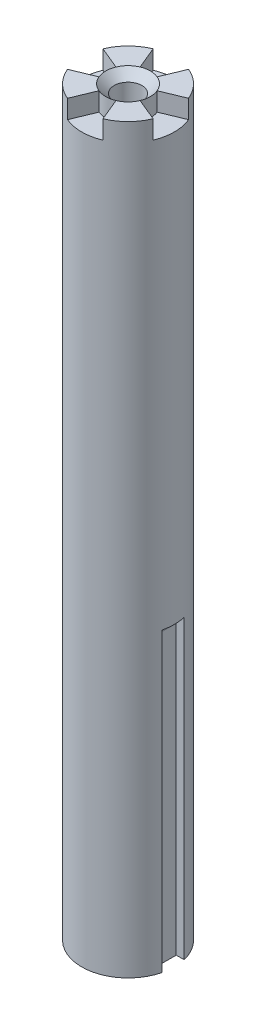
ISO-10303-21;
HEADER;
FILE_DESCRIPTION(('STEP AP214'),'2;1');
FILE_NAME('part.step','',(''),(''),'','','');
FILE_SCHEMA(('AUTOMOTIVE_DESIGN { 1 0 10303 214 1 1 1 1 }'));
ENDSEC;
DATA;
#1=APPLICATION_CONTEXT('core data for automotive mechanical design processes');
#2=APPLICATION_PROTOCOL_DEFINITION('international standard','automotive_design',2000,#1);
#3=PRODUCT_CONTEXT('',#1,'mechanical');
#4=PRODUCT('Part','Part','',(#3));
#5=PRODUCT_RELATED_PRODUCT_CATEGORY('part','',(#4));
#6=PRODUCT_DEFINITION_FORMATION('','',#4);
#7=PRODUCT_DEFINITION_CONTEXT('part definition',#1,'design');
#8=PRODUCT_DEFINITION('design','',#6,#7);
#9=PRODUCT_DEFINITION_SHAPE('','',#8);
#10=(LENGTH_UNIT() NAMED_UNIT(*) SI_UNIT(.MILLI.,.METRE.));
#11=(NAMED_UNIT(*) PLANE_ANGLE_UNIT() SI_UNIT($,.RADIAN.));
#12=(NAMED_UNIT(*) SI_UNIT($,.STERADIAN.) SOLID_ANGLE_UNIT());
#13=UNCERTAINTY_MEASURE_WITH_UNIT(LENGTH_MEASURE(1.E-05),#10,'distance_accuracy_value','');
#14=(GEOMETRIC_REPRESENTATION_CONTEXT(3) GLOBAL_UNCERTAINTY_ASSIGNED_CONTEXT((#13)) GLOBAL_UNIT_ASSIGNED_CONTEXT((#10,
#11,#12)) REPRESENTATION_CONTEXT('',''));
#15=CARTESIAN_POINT('',(0.,0.,0.));
#16=DIRECTION('',(0.,0.,1.));
#17=DIRECTION('',(1.,0.,0.));
#18=AXIS2_PLACEMENT_3D('',#15,#16,#17);
#19=CARTESIAN_POINT('',(0.,101.6,0.));
#20=DIRECTION('',(0.,1.,0.));
#21=DIRECTION('',(0.,0.,1.));
#22=AXIS2_PLACEMENT_3D('',#19,#20,#21);
#23=PLANE('',#22);
#24=DIRECTION('',(-0.382683432365091,0.,0.923879532511287));
#25=VECTOR('',#24,1.);
#26=CARTESIAN_POINT('',(-2.43003979551833,101.6,5.86663503144667));
#27=LINE('',#26,#25);
#28=CARTESIAN_POINT('',(-1.1664191018488,101.6,2.8159848150944));
#29=VERTEX_POINT('',#28);
#30=CARTESIAN_POINT('',(-2.43003979551833,101.6,5.86663503144667));
#31=VERTEX_POINT('',#30);
#32=EDGE_CURVE('E223',#29,#31,#27,.T.);
#33=ORIENTED_EDGE('',*,*,#32,.F.);
#34=CARTESIAN_POINT('',(0.,101.6,0.));
#35=DIRECTION('',(0.,1.,0.));
#36=DIRECTION('',(0.,0.,1.));
#37=AXIS2_PLACEMENT_3D('',#34,#35,#36);
#38=CIRCLE('',#37,3.048);
#39=CARTESIAN_POINT('',(-2.8159848150944,101.6,1.1664191018488));
#40=VERTEX_POINT('',#39);
#41=EDGE_CURVE('E325',#40,#29,#38,.T.);
#42=ORIENTED_EDGE('',*,*,#41,.F.);
#43=DIRECTION('',(0.92387953251129,0.,-0.382683432365084));
#44=VECTOR('',#43,1.);
#45=CARTESIAN_POINT('',(-5.86663503144668,101.6,2.43003979551831));
#46=LINE('',#45,#44);
#47=CARTESIAN_POINT('',(-5.86663503144668,101.6,2.43003979551831));
#48=VERTEX_POINT('',#47);
#49=EDGE_CURVE('E76',#48,#40,#46,.T.);
#50=ORIENTED_EDGE('',*,*,#49,.F.);
#51=CARTESIAN_POINT('',(0.,101.6,0.));
#52=DIRECTION('',(0.,1.,0.));
#53=DIRECTION('',(0.,0.,1.));
#54=AXIS2_PLACEMENT_3D('',#51,#52,#53);
#55=CIRCLE('',#54,6.35);
#56=EDGE_CURVE('E352',#48,#31,#55,.T.);
#57=ORIENTED_EDGE('',*,*,#56,.T.);
#58=EDGE_LOOP('',(#33,#42,#50,#57));
#59=FACE_BOUND('',#58,.T.);
#60=ADVANCED_FACE('F56',(#59),#23,.T.);
#61=DIRECTION('',(-0.923879532511284,0.,-0.382683432365097));
#62=VECTOR('',#61,1.);
#63=CARTESIAN_POINT('',(-5.86663503144666,101.6,-2.43003979551835));
#64=LINE('',#63,#62);
#65=CARTESIAN_POINT('',(-2.8159848150944,101.6,-1.1664191018488));
#66=VERTEX_POINT('',#65);
#67=CARTESIAN_POINT('',(-5.86663503144666,101.6,-2.43003979551835));
#68=VERTEX_POINT('',#67);
#69=EDGE_CURVE('E241',#66,#68,#64,.T.);
#70=ORIENTED_EDGE('',*,*,#69,.F.);
#71=CARTESIAN_POINT('',(-1.1664191018488,101.6,-2.8159848150944));
#72=VERTEX_POINT('',#71);
#73=EDGE_CURVE('E480',#72,#66,#38,.T.);
#74=ORIENTED_EDGE('',*,*,#73,.F.);
#75=DIRECTION('',(0.382683432365078,0.,0.923879532511292));
#76=VECTOR('',#75,1.);
#77=CARTESIAN_POINT('',(-2.43003979551829,101.6,-5.86663503144669));
#78=LINE('',#77,#76);
#79=CARTESIAN_POINT('',(-2.43003979551829,101.6,-5.86663503144669));
#80=VERTEX_POINT('',#79);
#81=EDGE_CURVE('E84',#80,#72,#78,.T.);
#82=ORIENTED_EDGE('',*,*,#81,.F.);
#83=EDGE_CURVE('E506',#80,#68,#55,.T.);
#84=ORIENTED_EDGE('',*,*,#83,.T.);
#85=EDGE_LOOP('',(#70,#74,#82,#84));
#86=FACE_BOUND('',#85,.T.);
#87=ADVANCED_FACE('F461',(#86),#23,.T.);
#88=DIRECTION('',(0.382683432365103,0.,-0.923879532511282));
#89=VECTOR('',#88,1.);
#90=CARTESIAN_POINT('',(2.43003979551837,101.6,-5.86663503144666));
#91=LINE('',#90,#89);
#92=CARTESIAN_POINT('',(1.1664191018488,101.6,-2.8159848150944));
#93=VERTEX_POINT('',#92);
#94=CARTESIAN_POINT('',(2.43003979551837,101.6,-5.86663503144666));
#95=VERTEX_POINT('',#94);
#96=EDGE_CURVE('E270',#93,#95,#91,.T.);
#97=ORIENTED_EDGE('',*,*,#96,.F.);
#98=CARTESIAN_POINT('',(2.8159848150944,101.6,-1.1664191018488));
#99=VERTEX_POINT('',#98);
#100=EDGE_CURVE('E324',#99,#93,#38,.T.);
#101=ORIENTED_EDGE('',*,*,#100,.F.);
#102=DIRECTION('',(-0.923879532511295,0.,0.382683432365072));
#103=VECTOR('',#102,1.);
#104=CARTESIAN_POINT('',(5.8666350314467,101.6,-2.43003979551827));
#105=LINE('',#104,#103);
#106=CARTESIAN_POINT('',(5.8666350314467,101.6,-2.43003979551827));
#107=VERTEX_POINT('',#106);
#108=EDGE_CURVE('E307',#107,#99,#105,.T.);
#109=ORIENTED_EDGE('',*,*,#108,.F.);
#110=EDGE_CURVE('E351',#107,#95,#55,.T.);
#111=ORIENTED_EDGE('',*,*,#110,.T.);
#112=EDGE_LOOP('',(#97,#101,#109,#111));
#113=FACE_BOUND('',#112,.T.);
#114=ADVANCED_FACE('F368',(#113),#23,.T.);
#115=CARTESIAN_POINT('',(0.,101.6,0.));
#116=DIRECTION('',(0.,-1.,0.));
#117=DIRECTION('',(0.,0.,-1.));
#118=AXIS2_PLACEMENT_3D('',#115,#116,#117);
#119=CYLINDRICAL_SURFACE('',#118,6.35);
#120=CARTESIAN_POINT('',(0.,99.06,0.));
#121=DIRECTION('',(0.,1.,0.));
#122=DIRECTION('',(0.,0.,1.));
#123=AXIS2_PLACEMENT_3D('',#120,#121,#122);
#124=CIRCLE('',#123,6.35);
#125=CARTESIAN_POINT('',(-2.43003979551833,99.06,5.86663503144667));
#126=VERTEX_POINT('',#125);
#127=CARTESIAN_POINT('',(2.43003979551833,99.06,5.86663503144667));
#128=VERTEX_POINT('',#127);
#129=EDGE_CURVE('E214',#126,#128,#124,.T.);
#130=ORIENTED_EDGE('',*,*,#129,.F.);
#131=DIRECTION('',(0.,1.,0.));
#132=VECTOR('',#131,1.);
#133=CARTESIAN_POINT('',(-2.43003979551833,99.06,5.86663503144667));
#134=LINE('',#133,#132);
#135=EDGE_CURVE('E481',#126,#31,#134,.T.);
#136=ORIENTED_EDGE('',*,*,#135,.T.);
#137=ORIENTED_EDGE('',*,*,#56,.F.);
#138=DIRECTION('',(0.,1.,0.));
#139=VECTOR('',#138,1.);
#140=CARTESIAN_POINT('',(-5.86663503144668,99.06,2.43003979551831));
#141=LINE('',#140,#139);
#142=CARTESIAN_POINT('',(-5.86663503144668,99.06,2.43003979551831));
#143=VERTEX_POINT('',#142);
#144=EDGE_CURVE('E250',#143,#48,#141,.T.);
#145=ORIENTED_EDGE('',*,*,#144,.F.);
#146=CARTESIAN_POINT('',(0.,99.06,0.));
#147=DIRECTION('',(0.,1.,0.));
#148=DIRECTION('',(0.,0.,1.));
#149=AXIS2_PLACEMENT_3D('',#146,#147,#148);
#150=CIRCLE('',#149,6.35);
#151=CARTESIAN_POINT('',(-5.86663503144667,99.06,-2.43003979551835));
#152=VERTEX_POINT('',#151);
#153=EDGE_CURVE('E237',#152,#143,#150,.T.);
#154=ORIENTED_EDGE('',*,*,#153,.F.);
#155=DIRECTION('',(0.,1.,0.));
#156=VECTOR('',#155,1.);
#157=CARTESIAN_POINT('',(-5.86663503144667,99.06,-2.43003979551835));
#158=LINE('',#157,#156);
#159=EDGE_CURVE('E257',#152,#68,#158,.T.);
#160=ORIENTED_EDGE('',*,*,#159,.T.);
#161=ORIENTED_EDGE('',*,*,#83,.F.);
#162=DIRECTION('',(0.,1.,0.));
#163=VECTOR('',#162,1.);
#164=CARTESIAN_POINT('',(-2.43003979551829,99.06,-5.86663503144669));
#165=LINE('',#164,#163);
#166=CARTESIAN_POINT('',(-2.43003979551829,99.06,-5.86663503144669));
#167=VERTEX_POINT('',#166);
#168=EDGE_CURVE('E279',#167,#80,#165,.T.);
#169=ORIENTED_EDGE('',*,*,#168,.F.);
#170=CARTESIAN_POINT('',(0.,99.06,0.));
#171=DIRECTION('',(0.,1.,0.));
#172=DIRECTION('',(0.,0.,1.));
#173=AXIS2_PLACEMENT_3D('',#170,#171,#172);
#174=CIRCLE('',#173,6.35);
#175=CARTESIAN_POINT('',(2.43003979551837,99.06,-5.86663503144666));
#176=VERTEX_POINT('',#175);
#177=EDGE_CURVE('E266',#176,#167,#174,.T.);
#178=ORIENTED_EDGE('',*,*,#177,.F.);
#179=DIRECTION('',(0.,1.,0.));
#180=VECTOR('',#179,1.);
#181=CARTESIAN_POINT('',(2.43003979551837,99.06,-5.86663503144666));
#182=LINE('',#181,#180);
#183=EDGE_CURVE('E253',#176,#95,#182,.T.);
#184=ORIENTED_EDGE('',*,*,#183,.T.);
#185=ORIENTED_EDGE('',*,*,#110,.F.);
#186=DIRECTION('',(0.,1.,0.));
#187=VECTOR('',#186,1.);
#188=CARTESIAN_POINT('',(5.8666350314467,99.06,-2.43003979551827));
#189=LINE('',#188,#187);
#190=CARTESIAN_POINT('',(5.8666350314467,99.06,-2.43003979551827));
#191=VERTEX_POINT('',#190);
#192=EDGE_CURVE('E306',#191,#107,#189,.T.);
#193=ORIENTED_EDGE('',*,*,#192,.F.);
#194=CARTESIAN_POINT('',(0.,99.06,0.));
#195=DIRECTION('',(0.,1.,0.));
#196=DIRECTION('',(0.,0.,1.));
#197=AXIS2_PLACEMENT_3D('',#194,#195,#196);
#198=CIRCLE('',#197,6.35);
#199=CARTESIAN_POINT('',(5.86663503144665,99.06,2.43003979551839));
#200=VERTEX_POINT('',#199);
#201=EDGE_CURVE('E293',#200,#191,#198,.T.);
#202=ORIENTED_EDGE('',*,*,#201,.F.);
#203=DIRECTION('',(0.,1.,0.));
#204=VECTOR('',#203,1.);
#205=CARTESIAN_POINT('',(5.86663503144665,99.06,2.43003979551839));
#206=LINE('',#205,#204);
#207=CARTESIAN_POINT('',(5.86663503144665,101.6,2.43003979551839));
#208=VERTEX_POINT('',#207);
#209=EDGE_CURVE('E282',#200,#208,#206,.T.);
#210=ORIENTED_EDGE('',*,*,#209,.T.);
#211=CARTESIAN_POINT('',(2.43003979551833,101.6,5.86663503144667));
#212=VERTEX_POINT('',#211);
#213=EDGE_CURVE('E230',#212,#208,#55,.T.);
#214=ORIENTED_EDGE('',*,*,#213,.F.);
#215=DIRECTION('',(0.,1.,0.));
#216=VECTOR('',#215,1.);
#217=CARTESIAN_POINT('',(2.43003979551833,99.06,5.86663503144667));
#218=LINE('',#217,#216);
#219=EDGE_CURVE('E206',#128,#212,#218,.T.);
#220=ORIENTED_EDGE('',*,*,#219,.F.);
#221=EDGE_LOOP('',(#130,#136,#137,#145,#154,#160,#161,#169,#178,#184,#185,#193,#202,#210,#214,#220));
#222=FACE_BOUND('',#221,.T.);
#223=DIRECTION('',(0.,-1.,0.));
#224=VECTOR('',#223,1.);
#225=CARTESIAN_POINT('',(6.1644078385519,40.64,1.524));
#226=LINE('',#225,#224);
#227=CARTESIAN_POINT('',(6.1644078385519,40.6263660094133,1.524));
#228=VERTEX_POINT('',#227);
#229=CARTESIAN_POINT('',(6.1644078385519,0.,1.524));
#230=VERTEX_POINT('',#229);
#231=EDGE_CURVE('E340',#228,#230,#226,.T.);
#232=ORIENTED_EDGE('',*,*,#231,.F.);
#233=CARTESIAN_POINT('',(6.1644078385519,40.6263660094133,1.524));
#234=CARTESIAN_POINT('',(6.1798203609569,40.6286386184408,1.4616590567087));
#235=CARTESIAN_POINT('',(6.19428886265832,40.6304907967999,1.39907540649519));
#236=CARTESIAN_POINT('',(6.22132300982925,40.6335384012742,1.27348550614949));
#237=CARTESIAN_POINT('',(6.2338887495537,40.6347338599283,1.21047927711168));
#238=CARTESIAN_POINT('',(6.26862280986946,40.6376042038102,1.02139583434353));
#239=CARTESIAN_POINT('',(6.28794622912084,40.6385776341967,0.89477525458629));
#240=CARTESIAN_POINT('',(6.3189022356201,40.6397136799146,0.640598246259459));
#241=CARTESIAN_POINT('',(6.33053492832501,40.639876306364,0.513041830546522));
#242=CARTESIAN_POINT('',(6.34220031806305,40.6399811653716,0.32113074344049));
#243=CARTESIAN_POINT('',(6.34512485961095,40.6399928265535,0.256940998112656));
#244=CARTESIAN_POINT('',(6.3490247241951,40.640000435766,0.128502050799768));
#245=CARTESIAN_POINT('',(6.35000003908424,40.639996383731,0.0642528485673284));
#246=CARTESIAN_POINT('',(6.35,40.64,0.));
#247=B_SPLINE_CURVE_WITH_KNOTS('',3,(#233,#234,#235,#236,#237,#238,#239,#240,#241,#242,#243,
#244,#245,#246),.UNSPECIFIED.,.F.,.F.,(4,2,2,2,2,2,4),(0.,0.192755135212261,0.385500719007915,
0.769514909266387,1.15352383372331,1.3462668856024,1.5390107430807),.UNSPECIFIED.);
#248=CARTESIAN_POINT('',(6.35,40.64,0.));
#249=VERTEX_POINT('',#248);
#250=EDGE_CURVE('E13',#228,#249,#247,.T.);
#251=ORIENTED_EDGE('',*,*,#250,.T.);
#252=CARTESIAN_POINT('',(6.35,40.64,0.));
#253=CARTESIAN_POINT('',(6.35000003908424,40.639996383731,-0.0642528485673275));
#254=CARTESIAN_POINT('',(6.3490247241951,40.640000435766,-0.128502050799768));
#255=CARTESIAN_POINT('',(6.34512485961095,40.6399928265535,-0.256940998112655));
#256=CARTESIAN_POINT('',(6.34220031806305,40.6399811653716,-0.32113074344049));
#257=CARTESIAN_POINT('',(6.33053492832501,40.639876306364,-0.513041830546522));
#258=CARTESIAN_POINT('',(6.3189022356201,40.6397136799146,-0.640598246259459));
#259=CARTESIAN_POINT('',(6.28794622912084,40.6385776341967,-0.89477525458629));
#260=CARTESIAN_POINT('',(6.26862280986946,40.6376042038102,-1.02139583434353));
#261=CARTESIAN_POINT('',(6.2338887495537,40.6347338599283,-1.21047927711168));
#262=CARTESIAN_POINT('',(6.22132300982925,40.6335384012742,-1.27348550614949));
#263=CARTESIAN_POINT('',(6.19428886265832,40.6304907967999,-1.39907540649519));
#264=CARTESIAN_POINT('',(6.1798203609569,40.6286386184408,-1.4616590567087));
#265=CARTESIAN_POINT('',(6.1644078385519,40.6263660094133,-1.524));
#266=B_SPLINE_CURVE_WITH_KNOTS('',3,(#252,#253,#254,#255,#256,#257,#258,#259,#260,#261,#262,
#263,#264,#265),.UNSPECIFIED.,.F.,.F.,(4,2,2,2,2,2,4),(0.,0.1927438574783,0.38548690935739,
0.769495833814311,1.15351002407278,1.34625560786844,1.5390107430807),.UNSPECIFIED.);
#267=CARTESIAN_POINT('',(6.1644078385519,40.6263660094133,-1.524));
#268=VERTEX_POINT('',#267);
#269=EDGE_CURVE('E69',#249,#268,#266,.T.);
#270=ORIENTED_EDGE('',*,*,#269,.T.);
#271=DIRECTION('',(0.,-1.,0.));
#272=VECTOR('',#271,1.);
#273=CARTESIAN_POINT('',(6.1644078385519,40.64,-1.524));
#274=LINE('',#273,#272);
#275=CARTESIAN_POINT('',(6.1644078385519,0.,-1.524));
#276=VERTEX_POINT('',#275);
#277=EDGE_CURVE('E341',#268,#276,#274,.T.);
#278=ORIENTED_EDGE('',*,*,#277,.T.);
#279=CARTESIAN_POINT('',(0.,0.,0.));
#280=DIRECTION('',(0.,1.,0.));
#281=DIRECTION('',(0.,0.,1.));
#282=AXIS2_PLACEMENT_3D('',#279,#280,#281);
#283=CIRCLE('',#282,6.35);
#284=EDGE_CURVE('E343',#276,#230,#283,.T.);
#285=ORIENTED_EDGE('',*,*,#284,.T.);
#286=EDGE_LOOP('',(#232,#251,#270,#278,#285));
#287=FACE_BOUND('',#286,.T.);
#288=ADVANCED_FACE('F226',(#222,#287),#119,.T.);
#289=DIRECTION('',(-0.382683432365091,0.,-0.923879532511287));
#290=VECTOR('',#289,1.);
#291=CARTESIAN_POINT('',(2.43003979551833,101.6,5.86663503144667));
#292=LINE('',#291,#290);
#293=CARTESIAN_POINT('',(1.1664191018488,101.6,2.8159848150944));
#294=VERTEX_POINT('',#293);
#295=EDGE_CURVE('E260',#212,#294,#292,.T.);
#296=ORIENTED_EDGE('',*,*,#295,.F.);
#297=ORIENTED_EDGE('',*,*,#213,.T.);
#298=DIRECTION('',(0.923879532511279,0.,0.382683432365109));
#299=VECTOR('',#298,1.);
#300=CARTESIAN_POINT('',(5.86663503144665,101.6,2.43003979551839));
#301=LINE('',#300,#299);
#302=CARTESIAN_POINT('',(2.8159848150944,101.6,1.1664191018488));
#303=VERTEX_POINT('',#302);
#304=EDGE_CURVE('E297',#303,#208,#301,.T.);
#305=ORIENTED_EDGE('',*,*,#304,.F.);
#306=EDGE_CURVE('E320',#294,#303,#38,.T.);
#307=ORIENTED_EDGE('',*,*,#306,.F.);
#308=EDGE_LOOP('',(#296,#297,#305,#307));
#309=FACE_BOUND('',#308,.T.);
#310=ADVANCED_FACE('F367',(#309),#23,.T.);
#311=CARTESIAN_POINT('',(0.,0.,0.));
#312=DIRECTION('',(0.,1.,0.));
#313=DIRECTION('',(0.,0.,1.));
#314=AXIS2_PLACEMENT_3D('',#311,#312,#313);
#315=PLANE('',#314);
#316=ORIENTED_EDGE('',*,*,#284,.F.);
#317=DIRECTION('',(1.,0.,0.));
#318=VECTOR('',#317,1.);
#319=CARTESIAN_POINT('',(5.08,0.,-1.524));
#320=LINE('',#319,#318);
#321=CARTESIAN_POINT('',(5.08,0.,-1.524));
#322=VERTEX_POINT('',#321);
#323=EDGE_CURVE('E337',#322,#276,#320,.T.);
#324=ORIENTED_EDGE('',*,*,#323,.F.);
#325=DIRECTION('',(0.,0.,-1.));
#326=VECTOR('',#325,1.);
#327=CARTESIAN_POINT('',(5.08,0.,1.524));
#328=LINE('',#327,#326);
#329=CARTESIAN_POINT('',(5.08,0.,1.524));
#330=VERTEX_POINT('',#329);
#331=EDGE_CURVE('E334',#330,#322,#328,.T.);
#332=ORIENTED_EDGE('',*,*,#331,.F.);
#333=DIRECTION('',(-1.,0.,0.));
#334=VECTOR('',#333,1.);
#335=CARTESIAN_POINT('',(6.1644078385519,0.,1.524));
#336=LINE('',#335,#334);
#337=EDGE_CURVE('E331',#230,#330,#336,.T.);
#338=ORIENTED_EDGE('',*,*,#337,.F.);
#339=EDGE_LOOP('',(#316,#324,#332,#338));
#340=FACE_BOUND('',#339,.T.);
#341=ADVANCED_FACE('F369',(#340),#315,.F.);
#342=CARTESIAN_POINT('',(5.08,40.64,-1.524));
#343=DIRECTION('',(0.,0.,-1.));
#344=DIRECTION('',(-1.,0.,0.));
#345=AXIS2_PLACEMENT_3D('',#342,#343,#344);
#346=PLANE('',#345);
#347=ORIENTED_EDGE('',*,*,#277,.F.);
#348=CARTESIAN_POINT('',(6.35,39.37,-1.524));
#349=DIRECTION('',(0.,0.,-1.));
#350=DIRECTION('',(-1.,0.,0.));
#351=AXIS2_PLACEMENT_3D('',#348,#349,#350);
#352=CIRCLE('',#351,1.27);
#353=CARTESIAN_POINT('',(5.08,39.37,-1.524));
#354=VERTEX_POINT('',#353);
#355=EDGE_CURVE('E350',#268,#354,#352,.F.);
#356=ORIENTED_EDGE('',*,*,#355,.T.);
#357=DIRECTION('',(0.,-1.,0.));
#358=VECTOR('',#357,1.);
#359=CARTESIAN_POINT('',(5.08,40.64,-1.524));
#360=LINE('',#359,#358);
#361=EDGE_CURVE('E344',#354,#322,#360,.T.);
#362=ORIENTED_EDGE('',*,*,#361,.T.);
#363=ORIENTED_EDGE('',*,*,#323,.T.);
#364=EDGE_LOOP('',(#347,#356,#362,#363));
#365=FACE_BOUND('',#364,.T.);
#366=ADVANCED_FACE('F373',(#365),#346,.F.);
#367=CARTESIAN_POINT('',(5.08,40.64,1.524));
#368=DIRECTION('',(-1.,0.,0.));
#369=DIRECTION('',(0.,0.,1.));
#370=AXIS2_PLACEMENT_3D('',#367,#368,#369);
#371=PLANE('',#370);
#372=ORIENTED_EDGE('',*,*,#361,.F.);
#373=DIRECTION('',(0.,0.,-1.));
#374=VECTOR('',#373,1.);
#375=CARTESIAN_POINT('',(5.08,39.37,1.524));
#376=LINE('',#375,#374);
#377=CARTESIAN_POINT('',(5.08,39.37,1.524));
#378=VERTEX_POINT('',#377);
#379=EDGE_CURVE('E356',#354,#378,#376,.F.);
#380=ORIENTED_EDGE('',*,*,#379,.T.);
#381=DIRECTION('',(0.,-1.,0.));
#382=VECTOR('',#381,1.);
#383=CARTESIAN_POINT('',(5.08,40.64,1.524));
#384=LINE('',#383,#382);
#385=EDGE_CURVE('E346',#378,#330,#384,.T.);
#386=ORIENTED_EDGE('',*,*,#385,.T.);
#387=ORIENTED_EDGE('',*,*,#331,.T.);
#388=EDGE_LOOP('',(#372,#380,#386,#387));
#389=FACE_BOUND('',#388,.T.);
#390=ADVANCED_FACE('F381',(#389),#371,.F.);
#391=CARTESIAN_POINT('',(6.1644078385519,40.64,1.524));
#392=DIRECTION('',(0.,0.,1.));
#393=DIRECTION('',(1.,0.,0.));
#394=AXIS2_PLACEMENT_3D('',#391,#392,#393);
#395=PLANE('',#394);
#396=ORIENTED_EDGE('',*,*,#385,.F.);
#397=CARTESIAN_POINT('',(6.35,39.37,1.524));
#398=DIRECTION('',(0.,0.,1.));
#399=DIRECTION('',(1.,0.,0.));
#400=AXIS2_PLACEMENT_3D('',#397,#398,#399);
#401=CIRCLE('',#400,1.27);
#402=EDGE_CURVE('E359',#378,#228,#401,.F.);
#403=ORIENTED_EDGE('',*,*,#402,.T.);
#404=ORIENTED_EDGE('',*,*,#231,.T.);
#405=ORIENTED_EDGE('',*,*,#337,.T.);
#406=EDGE_LOOP('',(#396,#403,#404,#405));
#407=FACE_BOUND('',#406,.T.);
#408=ADVANCED_FACE('F378',(#407),#395,.F.);
#409=CARTESIAN_POINT('',(6.35,39.37,0.));
#410=DIRECTION('',(0.,0.,-1.));
#411=DIRECTION('',(-1.,0.,0.));
#412=AXIS2_PLACEMENT_3D('',#409,#410,#411);
#413=CYLINDRICAL_SURFACE('',#412,1.27);
#414=ORIENTED_EDGE('',*,*,#402,.F.);
#415=ORIENTED_EDGE('',*,*,#379,.F.);
#416=ORIENTED_EDGE('',*,*,#355,.F.);
#417=ORIENTED_EDGE('',*,*,#269,.F.);
#418=ORIENTED_EDGE('',*,*,#250,.F.);
#419=EDGE_LOOP('',(#414,#415,#416,#417,#418));
#420=FACE_BOUND('',#419,.T.);
#421=ADVANCED_FACE('F58',(#420),#413,.F.);
#422=CARTESIAN_POINT('',(0.,88.646,0.));
#423=DIRECTION('',(0.,1.,0.));
#424=DIRECTION('',(0.,0.,1.));
#425=AXIS2_PLACEMENT_3D('',#422,#423,#424);
#426=CONICAL_SURFACE('',#425,1.89865,1.02974425867665);
#427=CARTESIAN_POINT('',(0.,87.5051759856833,0.));
#428=VERTEX_POINT('',#427);
#429=VERTEX_LOOP('',#428);
#430=FACE_BOUND('',#429,.T.);
#431=CARTESIAN_POINT('',(0.,88.646,0.));
#432=DIRECTION('',(0.,1.,0.));
#433=DIRECTION('',(0.,0.,1.));
#434=AXIS2_PLACEMENT_3D('',#431,#432,#433);
#435=CIRCLE('',#434,1.89865);
#436=CARTESIAN_POINT('',(0.,88.646,1.89865));
#437=VERTEX_POINT('',#436);
#438=EDGE_CURVE('E328',#437,#437,#435,.T.);
#439=ORIENTED_EDGE('',*,*,#438,.T.);
#440=EDGE_LOOP('',(#439));
#441=FACE_BOUND('',#440,.T.);
#442=ADVANCED_FACE('F389',(#430,#441),#426,.F.);
#443=CARTESIAN_POINT('',(0.,101.6,0.));
#444=DIRECTION('',(0.,1.,0.));
#445=DIRECTION('',(0.,0.,1.));
#446=AXIS2_PLACEMENT_3D('',#443,#444,#445);
#447=CYLINDRICAL_SURFACE('',#446,1.89865);
#448=ORIENTED_EDGE('',*,*,#438,.F.);
#449=EDGE_LOOP('',(#448));
#450=FACE_BOUND('',#449,.T.);
#451=CARTESIAN_POINT('',(0.,100.45065,0.));
#452=DIRECTION('',(0.,1.,0.));
#453=DIRECTION('',(0.,0.,1.));
#454=AXIS2_PLACEMENT_3D('',#451,#452,#453);
#455=CIRCLE('',#454,1.89865);
#456=CARTESIAN_POINT('',(0.,100.45065,1.89865));
#457=VERTEX_POINT('',#456);
#458=EDGE_CURVE('E323',#457,#457,#455,.T.);
#459=ORIENTED_EDGE('',*,*,#458,.T.);
#460=EDGE_LOOP('',(#459));
#461=FACE_BOUND('',#460,.T.);
#462=ADVANCED_FACE('F392',(#450,#461),#447,.F.);
#463=CARTESIAN_POINT('',(0.,101.6,0.));
#464=DIRECTION('',(0.,1.,0.));
#465=DIRECTION('',(0.,0.,1.));
#466=AXIS2_PLACEMENT_3D('',#463,#464,#465);
#467=CONICAL_SURFACE('',#466,3.048,0.785398163397446);
#468=ORIENTED_EDGE('',*,*,#458,.F.);
#469=EDGE_LOOP('',(#468));
#470=FACE_BOUND('',#469,.T.);
#471=ORIENTED_EDGE('',*,*,#306,.T.);
#472=CARTESIAN_POINT('',(0.,101.6,0.));
#473=DIRECTION('',(0.,-1.,0.));
#474=DIRECTION('',(0.,0.,1.));
#475=AXIS2_PLACEMENT_3D('',#472,#473,#474);
#476=CIRCLE('',#475,3.048);
#477=EDGE_CURVE('E309',#99,#303,#476,.T.);
#478=ORIENTED_EDGE('',*,*,#477,.F.);
#479=ORIENTED_EDGE('',*,*,#100,.T.);
#480=CARTESIAN_POINT('',(0.,101.6,0.));
#481=DIRECTION('',(0.,-1.,0.));
#482=DIRECTION('',(0.,0.,1.));
#483=AXIS2_PLACEMENT_3D('',#480,#481,#482);
#484=CIRCLE('',#483,3.048);
#485=EDGE_CURVE('E281',#72,#93,#484,.T.);
#486=ORIENTED_EDGE('',*,*,#485,.F.);
#487=ORIENTED_EDGE('',*,*,#73,.T.);
#488=CARTESIAN_POINT('',(0.,101.6,0.));
#489=DIRECTION('',(0.,-1.,0.));
#490=DIRECTION('',(0.,0.,1.));
#491=AXIS2_PLACEMENT_3D('',#488,#489,#490);
#492=CIRCLE('',#491,3.048);
#493=EDGE_CURVE('E252',#40,#66,#492,.T.);
#494=ORIENTED_EDGE('',*,*,#493,.F.);
#495=ORIENTED_EDGE('',*,*,#41,.T.);
#496=CARTESIAN_POINT('',(0.,101.6,0.));
#497=DIRECTION('',(0.,-1.,0.));
#498=DIRECTION('',(0.,0.,1.));
#499=AXIS2_PLACEMENT_3D('',#496,#497,#498);
#500=CIRCLE('',#499,3.048);
#501=EDGE_CURVE('E473',#294,#29,#500,.T.);
#502=ORIENTED_EDGE('',*,*,#501,.F.);
#503=EDGE_LOOP('',(#471,#478,#479,#486,#487,#494,#495,#502));
#504=FACE_BOUND('',#503,.T.);
#505=ADVANCED_FACE('F396',(#470,#504),#467,.F.);
#506=CARTESIAN_POINT('',(5.86663503144665,99.06,2.43003979551839));
#507=DIRECTION('',(-0.382683432365109,0.,0.923879532511279));
#508=DIRECTION('',(0.923879532511279,0.,0.382683432365109));
#509=AXIS2_PLACEMENT_3D('',#506,#507,#508);
#510=PLANE('',#509);
#511=ORIENTED_EDGE('',*,*,#304,.T.);
#512=ORIENTED_EDGE('',*,*,#209,.F.);
#513=DIRECTION('',(0.923879532511279,0.,0.382683432365109));
#514=VECTOR('',#513,1.);
#515=CARTESIAN_POINT('',(5.86663503144665,99.06,2.43003979551839));
#516=LINE('',#515,#514);
#517=CARTESIAN_POINT('',(2.8159848150944,99.06,1.1664191018488));
#518=VERTEX_POINT('',#517);
#519=EDGE_CURVE('E303',#518,#200,#516,.T.);
#520=ORIENTED_EDGE('',*,*,#519,.F.);
#521=DIRECTION('',(0.,1.,0.));
#522=VECTOR('',#521,1.);
#523=CARTESIAN_POINT('',(2.8159848150944,99.06,1.1664191018488));
#524=LINE('',#523,#522);
#525=EDGE_CURVE('E314',#518,#303,#524,.T.);
#526=ORIENTED_EDGE('',*,*,#525,.T.);
#527=EDGE_LOOP('',(#511,#512,#520,#526));
#528=FACE_BOUND('',#527,.T.);
#529=ADVANCED_FACE('F400',(#528),#510,.F.);
#530=CARTESIAN_POINT('',(0.,99.06,0.));
#531=DIRECTION('',(0.,1.,0.));
#532=DIRECTION('',(0.,0.,1.));
#533=AXIS2_PLACEMENT_3D('',#530,#531,#532);
#534=CYLINDRICAL_SURFACE('',#533,3.048);
#535=ORIENTED_EDGE('',*,*,#477,.T.);
#536=ORIENTED_EDGE('',*,*,#525,.F.);
#537=CARTESIAN_POINT('',(0.,99.06,0.));
#538=DIRECTION('',(0.,-1.,0.));
#539=DIRECTION('',(0.,0.,1.));
#540=AXIS2_PLACEMENT_3D('',#537,#538,#539);
#541=CIRCLE('',#540,3.048);
#542=CARTESIAN_POINT('',(2.8159848150944,99.06,-1.1664191018488));
#543=VERTEX_POINT('',#542);
#544=EDGE_CURVE('E300',#543,#518,#541,.T.);
#545=ORIENTED_EDGE('',*,*,#544,.F.);
#546=DIRECTION('',(0.,1.,0.));
#547=VECTOR('',#546,1.);
#548=CARTESIAN_POINT('',(2.8159848150944,99.06,-1.1664191018488));
#549=LINE('',#548,#547);
#550=EDGE_CURVE('E316',#543,#99,#549,.T.);
#551=ORIENTED_EDGE('',*,*,#550,.T.);
#552=EDGE_LOOP('',(#535,#536,#545,#551));
#553=FACE_BOUND('',#552,.T.);
#554=ADVANCED_FACE('F406',(#553),#534,.T.);
#555=CARTESIAN_POINT('',(5.8666350314467,99.06,-2.43003979551827));
#556=DIRECTION('',(-0.382683432365072,0.,-0.923879532511295));
#557=DIRECTION('',(-0.923879532511295,0.,0.382683432365072));
#558=AXIS2_PLACEMENT_3D('',#555,#556,#557);
#559=PLANE('',#558);
#560=ORIENTED_EDGE('',*,*,#108,.T.);
#561=ORIENTED_EDGE('',*,*,#550,.F.);
#562=DIRECTION('',(-0.923879532511295,0.,0.382683432365072));
#563=VECTOR('',#562,1.);
#564=CARTESIAN_POINT('',(5.8666350314467,99.06,-2.43003979551827));
#565=LINE('',#564,#563);
#566=EDGE_CURVE('E296',#191,#543,#565,.T.);
#567=ORIENTED_EDGE('',*,*,#566,.F.);
#568=ORIENTED_EDGE('',*,*,#192,.T.);
#569=EDGE_LOOP('',(#560,#561,#567,#568));
#570=FACE_BOUND('',#569,.T.);
#571=ADVANCED_FACE('F402',(#570),#559,.F.);
#572=CARTESIAN_POINT('',(0.,99.06,0.));
#573=DIRECTION('',(0.,1.,0.));
#574=DIRECTION('',(0.,0.,1.));
#575=AXIS2_PLACEMENT_3D('',#572,#573,#574);
#576=PLANE('',#575);
#577=ORIENTED_EDGE('',*,*,#201,.T.);
#578=ORIENTED_EDGE('',*,*,#566,.T.);
#579=ORIENTED_EDGE('',*,*,#544,.T.);
#580=ORIENTED_EDGE('',*,*,#519,.T.);
#581=EDGE_LOOP('',(#577,#578,#579,#580));
#582=FACE_BOUND('',#581,.T.);
#583=ADVANCED_FACE('F405',(#582),#576,.T.);
#584=CARTESIAN_POINT('',(2.43003979551837,99.06,-5.86663503144666));
#585=DIRECTION('',(0.923879532511282,0.,0.382683432365103));
#586=DIRECTION('',(0.382683432365103,0.,-0.923879532511282));
#587=AXIS2_PLACEMENT_3D('',#584,#585,#586);
#588=PLANE('',#587);
#589=ORIENTED_EDGE('',*,*,#96,.T.);
#590=ORIENTED_EDGE('',*,*,#183,.F.);
#591=DIRECTION('',(0.382683432365103,0.,-0.923879532511282));
#592=VECTOR('',#591,1.);
#593=CARTESIAN_POINT('',(2.43003979551837,99.06,-5.86663503144666));
#594=LINE('',#593,#592);
#595=CARTESIAN_POINT('',(1.1664191018488,99.06,-2.8159848150944));
#596=VERTEX_POINT('',#595);
#597=EDGE_CURVE('E276',#596,#176,#594,.T.);
#598=ORIENTED_EDGE('',*,*,#597,.F.);
#599=DIRECTION('',(0.,1.,0.));
#600=VECTOR('',#599,1.);
#601=CARTESIAN_POINT('',(1.1664191018488,99.06,-2.8159848150944));
#602=LINE('',#601,#600);
#603=EDGE_CURVE('E288',#596,#93,#602,.T.);
#604=ORIENTED_EDGE('',*,*,#603,.T.);
#605=EDGE_LOOP('',(#589,#590,#598,#604));
#606=FACE_BOUND('',#605,.T.);
#607=ADVANCED_FACE('F416',(#606),#588,.F.);
#608=CARTESIAN_POINT('',(0.,99.06,0.));
#609=DIRECTION('',(0.,1.,0.));
#610=DIRECTION('',(0.,0.,1.));
#611=AXIS2_PLACEMENT_3D('',#608,#609,#610);
#612=CYLINDRICAL_SURFACE('',#611,3.048);
#613=ORIENTED_EDGE('',*,*,#485,.T.);
#614=ORIENTED_EDGE('',*,*,#603,.F.);
#615=CARTESIAN_POINT('',(0.,99.06,0.));
#616=DIRECTION('',(0.,-1.,0.));
#617=DIRECTION('',(0.,0.,1.));
#618=AXIS2_PLACEMENT_3D('',#615,#616,#617);
#619=CIRCLE('',#618,3.048);
#620=CARTESIAN_POINT('',(-1.1664191018488,99.06,-2.8159848150944));
#621=VERTEX_POINT('',#620);
#622=EDGE_CURVE('E273',#621,#596,#619,.T.);
#623=ORIENTED_EDGE('',*,*,#622,.F.);
#624=DIRECTION('',(0.,1.,0.));
#625=VECTOR('',#624,1.);
#626=CARTESIAN_POINT('',(-1.1664191018488,99.06,-2.8159848150944));
#627=LINE('',#626,#625);
#628=EDGE_CURVE('E290',#621,#72,#627,.T.);
#629=ORIENTED_EDGE('',*,*,#628,.T.);
#630=EDGE_LOOP('',(#613,#614,#623,#629));
#631=FACE_BOUND('',#630,.T.);
#632=ADVANCED_FACE('F422',(#631),#612,.T.);
#633=CARTESIAN_POINT('',(-2.43003979551829,99.06,-5.86663503144669));
#634=DIRECTION('',(-0.923879532511292,0.,0.382683432365078));
#635=DIRECTION('',(0.382683432365078,0.,0.923879532511292));
#636=AXIS2_PLACEMENT_3D('',#633,#634,#635);
#637=PLANE('',#636);
#638=ORIENTED_EDGE('',*,*,#81,.T.);
#639=ORIENTED_EDGE('',*,*,#628,.F.);
#640=DIRECTION('',(0.382683432365078,0.,0.923879532511292));
#641=VECTOR('',#640,1.);
#642=CARTESIAN_POINT('',(-2.43003979551829,99.06,-5.86663503144669));
#643=LINE('',#642,#641);
#644=EDGE_CURVE('E269',#167,#621,#643,.T.);
#645=ORIENTED_EDGE('',*,*,#644,.F.);
#646=ORIENTED_EDGE('',*,*,#168,.T.);
#647=EDGE_LOOP('',(#638,#639,#645,#646));
#648=FACE_BOUND('',#647,.T.);
#649=ADVANCED_FACE('F418',(#648),#637,.F.);
#650=CARTESIAN_POINT('',(0.,99.06,0.));
#651=DIRECTION('',(0.,1.,0.));
#652=DIRECTION('',(0.,0.,1.));
#653=AXIS2_PLACEMENT_3D('',#650,#651,#652);
#654=PLANE('',#653);
#655=ORIENTED_EDGE('',*,*,#177,.T.);
#656=ORIENTED_EDGE('',*,*,#644,.T.);
#657=ORIENTED_EDGE('',*,*,#622,.T.);
#658=ORIENTED_EDGE('',*,*,#597,.T.);
#659=EDGE_LOOP('',(#655,#656,#657,#658));
#660=FACE_BOUND('',#659,.T.);
#661=ADVANCED_FACE('F421',(#660),#654,.T.);
#662=CARTESIAN_POINT('',(-5.86663503144667,99.06,-2.43003979551835));
#663=DIRECTION('',(0.382683432365097,0.,-0.923879532511284));
#664=DIRECTION('',(-0.923879532511284,0.,-0.382683432365097));
#665=AXIS2_PLACEMENT_3D('',#662,#663,#664);
#666=PLANE('',#665);
#667=ORIENTED_EDGE('',*,*,#69,.T.);
#668=ORIENTED_EDGE('',*,*,#159,.F.);
#669=DIRECTION('',(-0.923879532511284,0.,-0.382683432365097));
#670=VECTOR('',#669,1.);
#671=CARTESIAN_POINT('',(-5.86663503144667,99.06,-2.43003979551835));
#672=LINE('',#671,#670);
#673=CARTESIAN_POINT('',(-2.8159848150944,99.06,-1.1664191018488));
#674=VERTEX_POINT('',#673);
#675=EDGE_CURVE('E247',#674,#152,#672,.T.);
#676=ORIENTED_EDGE('',*,*,#675,.F.);
#677=DIRECTION('',(0.,1.,0.));
#678=VECTOR('',#677,1.);
#679=CARTESIAN_POINT('',(-2.8159848150944,99.06,-1.1664191018488));
#680=LINE('',#679,#678);
#681=EDGE_CURVE('E261',#674,#66,#680,.T.);
#682=ORIENTED_EDGE('',*,*,#681,.T.);
#683=EDGE_LOOP('',(#667,#668,#676,#682));
#684=FACE_BOUND('',#683,.T.);
#685=ADVANCED_FACE('F431',(#684),#666,.F.);
#686=CARTESIAN_POINT('',(0.,99.06,0.));
#687=DIRECTION('',(0.,1.,0.));
#688=DIRECTION('',(0.,0.,1.));
#689=AXIS2_PLACEMENT_3D('',#686,#687,#688);
#690=CYLINDRICAL_SURFACE('',#689,3.048);
#691=ORIENTED_EDGE('',*,*,#493,.T.);
#692=ORIENTED_EDGE('',*,*,#681,.F.);
#693=CARTESIAN_POINT('',(0.,99.06,0.));
#694=DIRECTION('',(0.,-1.,0.));
#695=DIRECTION('',(0.,0.,1.));
#696=AXIS2_PLACEMENT_3D('',#693,#694,#695);
#697=CIRCLE('',#696,3.048);
#698=CARTESIAN_POINT('',(-2.8159848150944,99.06,1.1664191018488));
#699=VERTEX_POINT('',#698);
#700=EDGE_CURVE('E244',#699,#674,#697,.T.);
#701=ORIENTED_EDGE('',*,*,#700,.F.);
#702=DIRECTION('',(0.,1.,0.));
#703=VECTOR('',#702,1.);
#704=CARTESIAN_POINT('',(-2.8159848150944,99.06,1.1664191018488));
#705=LINE('',#704,#703);
#706=EDGE_CURVE('E263',#699,#40,#705,.T.);
#707=ORIENTED_EDGE('',*,*,#706,.T.);
#708=EDGE_LOOP('',(#691,#692,#701,#707));
#709=FACE_BOUND('',#708,.T.);
#710=ADVANCED_FACE('F437',(#709),#690,.T.);
#711=CARTESIAN_POINT('',(-5.86663503144668,99.06,2.43003979551831));
#712=DIRECTION('',(0.382683432365084,0.,0.92387953251129));
#713=DIRECTION('',(0.92387953251129,0.,-0.382683432365084));
#714=AXIS2_PLACEMENT_3D('',#711,#712,#713);
#715=PLANE('',#714);
#716=ORIENTED_EDGE('',*,*,#49,.T.);
#717=ORIENTED_EDGE('',*,*,#706,.F.);
#718=DIRECTION('',(0.92387953251129,0.,-0.382683432365084));
#719=VECTOR('',#718,1.);
#720=CARTESIAN_POINT('',(-5.86663503144668,99.06,2.43003979551831));
#721=LINE('',#720,#719);
#722=EDGE_CURVE('E240',#143,#699,#721,.T.);
#723=ORIENTED_EDGE('',*,*,#722,.F.);
#724=ORIENTED_EDGE('',*,*,#144,.T.);
#725=EDGE_LOOP('',(#716,#717,#723,#724));
#726=FACE_BOUND('',#725,.T.);
#727=ADVANCED_FACE('F433',(#726),#715,.F.);
#728=CARTESIAN_POINT('',(0.,99.06,0.));
#729=DIRECTION('',(0.,1.,0.));
#730=DIRECTION('',(0.,0.,1.));
#731=AXIS2_PLACEMENT_3D('',#728,#729,#730);
#732=PLANE('',#731);
#733=ORIENTED_EDGE('',*,*,#153,.T.);
#734=ORIENTED_EDGE('',*,*,#722,.T.);
#735=ORIENTED_EDGE('',*,*,#700,.T.);
#736=ORIENTED_EDGE('',*,*,#675,.T.);
#737=EDGE_LOOP('',(#733,#734,#735,#736));
#738=FACE_BOUND('',#737,.T.);
#739=ADVANCED_FACE('F436',(#738),#732,.T.);
#740=CARTESIAN_POINT('',(-2.43003979551833,99.06,5.86663503144667));
#741=DIRECTION('',(-0.923879532511287,0.,-0.382683432365091));
#742=DIRECTION('',(-0.382683432365091,0.,0.923879532511287));
#743=AXIS2_PLACEMENT_3D('',#740,#741,#742);
#744=PLANE('',#743);
#745=ORIENTED_EDGE('',*,*,#32,.T.);
#746=ORIENTED_EDGE('',*,*,#135,.F.);
#747=DIRECTION('',(-0.382683432365091,0.,0.923879532511287));
#748=VECTOR('',#747,1.);
#749=CARTESIAN_POINT('',(-2.43003979551833,99.06,5.86663503144667));
#750=LINE('',#749,#748);
#751=CARTESIAN_POINT('',(-1.1664191018488,99.06,2.8159848150944));
#752=VERTEX_POINT('',#751);
#753=EDGE_CURVE('E220',#752,#126,#750,.T.);
#754=ORIENTED_EDGE('',*,*,#753,.F.);
#755=DIRECTION('',(0.,1.,0.));
#756=VECTOR('',#755,1.);
#757=CARTESIAN_POINT('',(-1.1664191018488,99.06,2.8159848150944));
#758=LINE('',#757,#756);
#759=EDGE_CURVE('E232',#752,#29,#758,.T.);
#760=ORIENTED_EDGE('',*,*,#759,.T.);
#761=EDGE_LOOP('',(#745,#746,#754,#760));
#762=FACE_BOUND('',#761,.T.);
#763=ADVANCED_FACE('F446',(#762),#744,.F.);
#764=CARTESIAN_POINT('',(0.,99.06,0.));
#765=DIRECTION('',(0.,1.,0.));
#766=DIRECTION('',(0.,0.,1.));
#767=AXIS2_PLACEMENT_3D('',#764,#765,#766);
#768=CYLINDRICAL_SURFACE('',#767,3.048);
#769=ORIENTED_EDGE('',*,*,#501,.T.);
#770=ORIENTED_EDGE('',*,*,#759,.F.);
#771=CARTESIAN_POINT('',(0.,99.06,0.));
#772=DIRECTION('',(0.,-1.,0.));
#773=DIRECTION('',(0.,0.,1.));
#774=AXIS2_PLACEMENT_3D('',#771,#772,#773);
#775=CIRCLE('',#774,3.048);
#776=CARTESIAN_POINT('',(1.1664191018488,99.06,2.8159848150944));
#777=VERTEX_POINT('',#776);
#778=EDGE_CURVE('E213',#777,#752,#775,.T.);
#779=ORIENTED_EDGE('',*,*,#778,.F.);
#780=DIRECTION('',(0.,1.,0.));
#781=VECTOR('',#780,1.);
#782=CARTESIAN_POINT('',(1.1664191018488,99.06,2.8159848150944));
#783=LINE('',#782,#781);
#784=EDGE_CURVE('E209',#777,#294,#783,.T.);
#785=ORIENTED_EDGE('',*,*,#784,.T.);
#786=EDGE_LOOP('',(#769,#770,#779,#785));
#787=FACE_BOUND('',#786,.T.);
#788=ADVANCED_FACE('F450',(#787),#768,.T.);
#789=CARTESIAN_POINT('',(2.43003979551833,99.06,5.86663503144667));
#790=DIRECTION('',(0.923879532511287,0.,-0.38268343236509));
#791=DIRECTION('',(-0.382683432365091,0.,-0.923879532511287));
#792=AXIS2_PLACEMENT_3D('',#789,#790,#791);
#793=PLANE('',#792);
#794=ORIENTED_EDGE('',*,*,#295,.T.);
#795=ORIENTED_EDGE('',*,*,#784,.F.);
#796=DIRECTION('',(-0.382683432365091,0.,-0.923879532511287));
#797=VECTOR('',#796,1.);
#798=CARTESIAN_POINT('',(2.43003979551833,99.06,5.86663503144667));
#799=LINE('',#798,#797);
#800=EDGE_CURVE('E202',#128,#777,#799,.T.);
#801=ORIENTED_EDGE('',*,*,#800,.F.);
#802=ORIENTED_EDGE('',*,*,#219,.T.);
#803=EDGE_LOOP('',(#794,#795,#801,#802));
#804=FACE_BOUND('',#803,.T.);
#805=ADVANCED_FACE('F204',(#804),#793,.F.);
#806=CARTESIAN_POINT('',(0.,99.06,0.));
#807=DIRECTION('',(0.,1.,0.));
#808=DIRECTION('',(0.,0.,1.));
#809=AXIS2_PLACEMENT_3D('',#806,#807,#808);
#810=PLANE('',#809);
#811=ORIENTED_EDGE('',*,*,#129,.T.);
#812=ORIENTED_EDGE('',*,*,#800,.T.);
#813=ORIENTED_EDGE('',*,*,#778,.T.);
#814=ORIENTED_EDGE('',*,*,#753,.T.);
#815=EDGE_LOOP('',(#811,#812,#813,#814));
#816=FACE_BOUND('',#815,.T.);
#817=ADVANCED_FACE('F218',(#816),#810,.T.);
#818=CLOSED_SHELL('',(#60,#87,#114,#288,#310,#341,#366,#390,#408,#421,#442,#462,#505,#529,#554,
#571,#583,#607,#632,#649,#661,#685,#710,#727,#739,#763,#788,#805,#817));
#819=MANIFOLD_SOLID_BREP('B2',#818);
#820=ADVANCED_BREP_SHAPE_REPRESENTATION('',(#18,#819),#14);
#821=SHAPE_DEFINITION_REPRESENTATION(#9,#820);
ENDSEC;
END-ISO-10303-21;
